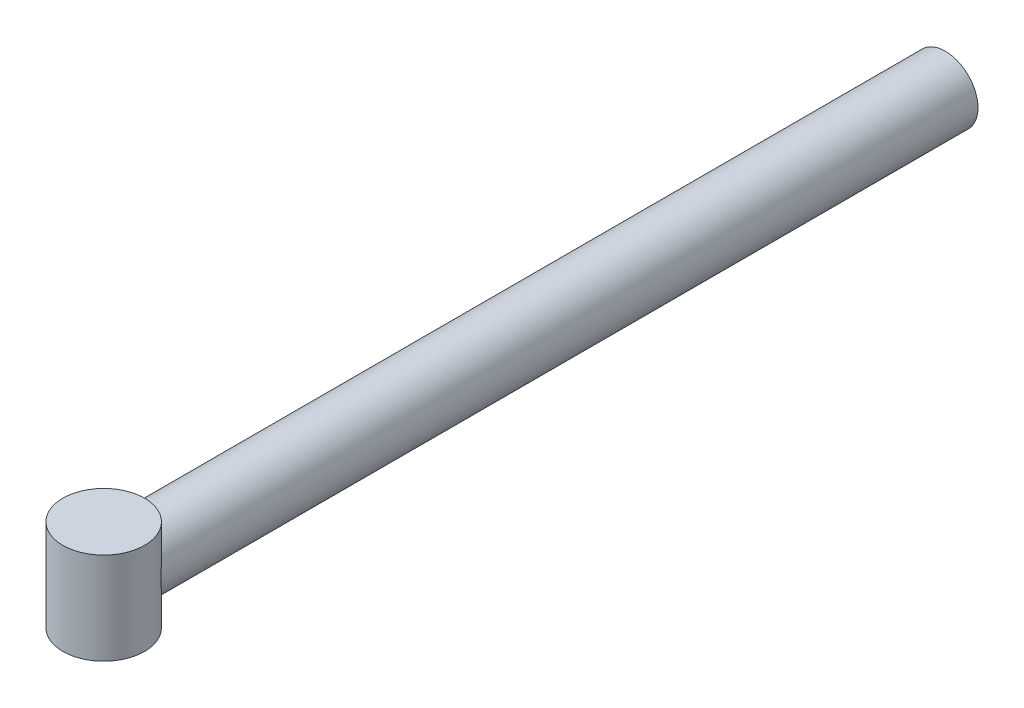
ISO-10303-21;
HEADER;
FILE_DESCRIPTION(('STEP AP214'),'2;1');
FILE_NAME('part.step','',(''),(''),'','','');
FILE_SCHEMA(('AUTOMOTIVE_DESIGN { 1 0 10303 214 1 1 1 1 }'));
ENDSEC;
DATA;
#1=APPLICATION_CONTEXT('core data for automotive mechanical design processes');
#2=APPLICATION_PROTOCOL_DEFINITION('international standard','automotive_design',2000,#1);
#3=PRODUCT_CONTEXT('',#1,'mechanical');
#4=PRODUCT('Part','Part','',(#3));
#5=PRODUCT_RELATED_PRODUCT_CATEGORY('part','',(#4));
#6=PRODUCT_DEFINITION_FORMATION('','',#4);
#7=PRODUCT_DEFINITION_CONTEXT('part definition',#1,'design');
#8=PRODUCT_DEFINITION('design','',#6,#7);
#9=PRODUCT_DEFINITION_SHAPE('','',#8);
#10=(LENGTH_UNIT() NAMED_UNIT(*) SI_UNIT(.MILLI.,.METRE.));
#11=(NAMED_UNIT(*) PLANE_ANGLE_UNIT() SI_UNIT($,.RADIAN.));
#12=(NAMED_UNIT(*) SI_UNIT($,.STERADIAN.) SOLID_ANGLE_UNIT());
#13=UNCERTAINTY_MEASURE_WITH_UNIT(LENGTH_MEASURE(1.E-05),#10,'distance_accuracy_value','');
#14=(GEOMETRIC_REPRESENTATION_CONTEXT(3) GLOBAL_UNCERTAINTY_ASSIGNED_CONTEXT((#13)) GLOBAL_UNIT_ASSIGNED_CONTEXT((#10,
#11,#12)) REPRESENTATION_CONTEXT('',''));
#15=CARTESIAN_POINT('',(0.,0.,0.));
#16=DIRECTION('',(0.,0.,1.));
#17=DIRECTION('',(1.,0.,0.));
#18=AXIS2_PLACEMENT_3D('',#15,#16,#17);
#19=CARTESIAN_POINT('',(0.,0.,196.));
#20=DIRECTION('',(0.,0.,-1.));
#21=DIRECTION('',(-1.,0.,0.));
#22=AXIS2_PLACEMENT_3D('',#19,#20,#21);
#23=CYLINDRICAL_SURFACE('',#22,8.);
#24=CARTESIAN_POINT('',(0.,0.,0.));
#25=DIRECTION('',(0.,0.,1.));
#26=DIRECTION('',(1.,0.,0.));
#27=AXIS2_PLACEMENT_3D('',#24,#25,#26);
#28=CIRCLE('',#27,8.);
#29=CARTESIAN_POINT('',(8.,0.,0.));
#30=VERTEX_POINT('',#29);
#31=EDGE_CURVE('E10',#30,#30,#28,.T.);
#32=ORIENTED_EDGE('',*,*,#31,.T.);
#33=EDGE_LOOP('',(#32));
#34=FACE_BOUND('',#33,.T.);
#35=CARTESIAN_POINT('',(-8.,0.,200.));
#36=CARTESIAN_POINT('',(-7.99999850547057,-0.150224597384872,199.999996437479));
#37=CARTESIAN_POINT('',(-7.99575712002106,-0.30050413160166,199.9943298853));
#38=CARTESIAN_POINT('',(-7.97889190649412,-0.599822762570288,199.971942989496));
#39=CARTESIAN_POINT('',(-7.96626236243051,-0.74886094324964,199.955215108327));
#40=CARTESIAN_POINT('',(-7.93287350748029,-1.04487223919572,199.911463888372));
#41=CARTESIAN_POINT('',(-7.9120936313708,-1.19183914867771,199.88441451072));
#42=CARTESIAN_POINT('',(-7.86281319571144,-1.4825420181236,199.821183730434));
#43=CARTESIAN_POINT('',(-7.83430749328154,-1.62627575657817,199.7849962459));
#44=CARTESIAN_POINT('',(-7.75884142962143,-1.95928819427814,199.690866152769));
#45=CARTESIAN_POINT('',(-7.70891139176625,-2.14699454247975,199.62973617357));
#46=CARTESIAN_POINT('',(-7.59693100706946,-2.51467773958043,199.496601236886));
#47=CARTESIAN_POINT('',(-7.53488026634113,-2.69465433705371,199.424595926003));
#48=CARTESIAN_POINT('',(-7.39933665411533,-3.04722385598971,199.272428278329));
#49=CARTESIAN_POINT('',(-7.32581587966415,-3.21979742729864,199.192246219351));
#50=CARTESIAN_POINT('',(-7.16807370451545,-3.55716094079826,199.026347294762));
#51=CARTESIAN_POINT('',(-7.08385257539726,-3.72195108039005,198.940630569649));
#52=CARTESIAN_POINT('',(-6.87278634555154,-4.10215769308784,198.73406817214));
#53=CARTESIAN_POINT('',(-6.74154128211599,-4.31433145410594,198.611728560567));
#54=CARTESIAN_POINT('',(-6.46055204176311,-4.72473552644333,198.364798740559));
#55=CARTESIAN_POINT('',(-6.31080122510044,-4.92296079286415,198.240207738109));
#56=CARTESIAN_POINT('',(-5.99323431368264,-5.30497690322164,197.99239839125));
#57=CARTESIAN_POINT('',(-5.82543282445919,-5.48877921215058,197.869179024771));
#58=CARTESIAN_POINT('',(-5.47186088496404,-5.84132029595654,197.627150024383));
#59=CARTESIAN_POINT('',(-5.2860964524364,-6.01006407939447,197.508338931992));
#60=CARTESIAN_POINT('',(-4.93523769395914,-6.29955870869471,197.300782280501));
#61=CARTESIAN_POINT('',(-4.773300959646,-6.42320823329404,197.210731223094));
#62=CARTESIAN_POINT('',(-4.43820831441267,-6.65914999828477,197.036857760384));
#63=CARTESIAN_POINT('',(-4.2650545845973,-6.77144443582189,196.95303415094));
#64=CARTESIAN_POINT('',(-3.90811229430166,-6.98353078174688,196.793217103482));
#65=CARTESIAN_POINT('',(-3.72433661319781,-7.0833373855595,196.717214480961));
#66=CARTESIAN_POINT('',(-3.34661343718592,-7.26942072543666,196.574454075727));
#67=CARTESIAN_POINT('',(-3.15266763681224,-7.35569970596085,196.507694759608));
#68=CARTESIAN_POINT('',(-2.78768994179332,-7.5007245521569,196.394837448765));
#69=CARTESIAN_POINT('',(-2.61802183428175,-7.56166661486986,196.34714401773));
#70=CARTESIAN_POINT('',(-2.27301580125697,-7.6724316798399,196.260131809181));
#71=CARTESIAN_POINT('',(-2.09767896323079,-7.72225680044521,196.220811436233));
#72=CARTESIAN_POINT('',(-1.74235286878641,-7.81010153789945,196.151296278787));
#73=CARTESIAN_POINT('',(-1.56236520089122,-7.84812512938336,196.12109842201));
#74=CARTESIAN_POINT('',(-1.19885362524063,-7.91181365838404,196.070426861491));
#75=CARTESIAN_POINT('',(-1.0153296752875,-7.93747844833067,196.049953273862));
#76=CARTESIAN_POINT('',(-0.645442904479308,-7.97609546968864,196.019120133535));
#77=CARTESIAN_POINT('',(-0.45907237895612,-7.98900275330996,196.008796341702));
#78=CARTESIAN_POINT('',(-0.0855968189260213,-8.00172379256273,195.99862164734));
#79=CARTESIAN_POINT('',(0.101508216993092,-8.00153752300758,195.998770764957));
#80=CARTESIAN_POINT('',(0.474947204374597,-7.98807470334787,196.009538482369));
#81=CARTESIAN_POINT('',(0.661281129513564,-7.97479771000683,196.020157436662));
#82=CARTESIAN_POINT('',(1.0317009677617,-7.93538178672806,196.051626094765));
#83=CARTESIAN_POINT('',(1.21578693261969,-7.90924315344384,196.072475562609));
#84=CARTESIAN_POINT('',(1.57035549635711,-7.84631181969092,196.122537409026));
#85=CARTESIAN_POINT('',(1.74103055156828,-7.81018184923011,196.151228579736));
#86=CARTESIAN_POINT('',(2.07822216463015,-7.72729892134606,196.216825294206));
#87=CARTESIAN_POINT('',(2.24473728927079,-7.68054235729816,196.253733626753));
#88=CARTESIAN_POINT('',(2.57267278104259,-7.5769987362147,196.335121115442));
#89=CARTESIAN_POINT('',(2.73409423889293,-7.52021384398611,196.379598637554));
#90=CARTESIAN_POINT('',(3.05123215137683,-7.39722556705918,196.475428168721));
#91=CARTESIAN_POINT('',(3.20694649201475,-7.33101873580909,196.52678269298));
#92=CARTESIAN_POINT('',(3.69392962994682,-7.10566605995238,196.700499974155));
#93=CARTESIAN_POINT('',(4.01344906782815,-6.92972868922836,196.834599444931));
#94=CARTESIAN_POINT('',(4.61890539752362,-6.54181378883855,197.124268199599));
#95=CARTESIAN_POINT('',(4.90482333755281,-6.32981608395801,197.279849493022));
#96=CARTESIAN_POINT('',(5.33520078810718,-5.96495562488034,197.540006894893));
#97=CARTESIAN_POINT('',(5.49079696244523,-5.82197680026018,197.640345745706));
#98=CARTESIAN_POINT('',(5.78920834677226,-5.52533478553694,197.844162126266));
#99=CARTESIAN_POINT('',(5.93202522428544,-5.37167299407892,197.947639244145));
#100=CARTESIAN_POINT('',(6.20495908338478,-5.05394986566675,198.156021177989));
#101=CARTESIAN_POINT('',(6.33505914332127,-4.88987513865481,198.260927690173));
#102=CARTESIAN_POINT('',(6.5822031705451,-4.55175259790762,198.470007691359));
#103=CARTESIAN_POINT('',(6.69924870134031,-4.37770598226785,198.57418126674));
#104=CARTESIAN_POINT('',(6.90938493162869,-4.03689456896995,198.76958112605));
#105=CARTESIAN_POINT('',(7.00369709967441,-3.87104374843251,198.861087845483));
#106=CARTESIAN_POINT('',(7.18111377588424,-3.53106003557809,199.039580949332));
#107=CARTESIAN_POINT('',(7.26421700200963,-3.35692619895513,199.12656681597));
#108=CARTESIAN_POINT('',(7.41852221314823,-3.00052371047962,199.293404863951));
#109=CARTESIAN_POINT('',(7.48974437690968,-2.81826953143255,199.373269031102));
#110=CARTESIAN_POINT('',(7.61961784585522,-2.44549083299329,199.523022591706));
#111=CARTESIAN_POINT('',(7.67827490034183,-2.2549701442279,199.592916542229));
#112=CARTESIAN_POINT('',(7.802468138106,-1.78888186265354,199.744236926416));
#113=CARTESIAN_POINT('',(7.86161401964439,-1.50937317616993,199.819362643878));
#114=CARTESIAN_POINT('',(7.92785703981829,-1.08163768728951,199.904890707339));
#115=CARTESIAN_POINT('',(7.94618750700997,-0.937742220797693,199.928866612479));
#116=CARTESIAN_POINT('',(7.97505562335784,-0.64782303658393,199.966835919483));
#117=CARTESIAN_POINT('',(7.98559344384275,-0.501799365724554,199.980829540816));
#118=CARTESIAN_POINT('',(7.99865927125614,-0.207894900109446,199.998202729218));
#119=CARTESIAN_POINT('',(8.00113968070391,-0.0600082318572548,200.001519222348));
#120=CARTESIAN_POINT('',(7.99789775429116,0.235510806429651,199.997197463397));
#121=CARTESIAN_POINT('',(7.99217554947408,0.383143180489197,199.989559386324));
#122=CARTESIAN_POINT('',(7.97265920777897,0.677069628848388,199.963696191809));
#123=CARTESIAN_POINT('',(7.95885728951073,0.8233622747526,199.945460868521));
#124=CARTESIAN_POINT('',(7.92347678294739,1.11350747652078,199.899233111825));
#125=CARTESIAN_POINT('',(7.90189335304496,1.2573584547189,199.871234604181));
#126=CARTESIAN_POINT('',(7.84493960984964,1.57788279667275,199.798422366849));
#127=CARTESIAN_POINT('',(7.80746054479984,1.75362146191373,199.751144510685));
#128=CARTESIAN_POINT('',(7.72176071100922,2.09907723166816,199.645550875675));
#129=CARTESIAN_POINT('',(7.6735345432082,2.26879125970797,199.587229551105));
#130=CARTESIAN_POINT('',(7.56699838694255,2.60215897488043,199.461857121497));
#131=CARTESIAN_POINT('',(7.50866488429104,2.76579742483155,199.394785751895));
#132=CARTESIAN_POINT('',(7.38261988831835,3.08652158747695,199.254197888836));
#133=CARTESIAN_POINT('',(7.31490797291799,3.24360700483515,199.180681105356));
#134=CARTESIAN_POINT('',(7.13750913219514,3.62179269911468,198.994344842242));
#135=CARTESIAN_POINT('',(7.02279764848337,3.83927496752558,198.87894097048));
#136=CARTESIAN_POINT('',(6.77531704020676,4.26085040578841,198.643074669565));
#137=CARTESIAN_POINT('',(6.64254050094868,4.46493802663262,198.522610177418));
#138=CARTESIAN_POINT('',(6.35927652866585,4.8599080288212,198.280260028642));
#139=CARTESIAN_POINT('',(6.20877175975432,5.05077718980287,198.158373087722));
#140=CARTESIAN_POINT('',(5.89040753321111,5.41869559737589,197.916493932003));
#141=CARTESIAN_POINT('',(5.72255079321846,5.59574700048332,197.796501423883));
#142=CARTESIAN_POINT('',(5.3670650550418,5.93770141714218,197.559567860182));
#143=CARTESIAN_POINT('',(5.17918701450815,6.10239378536135,197.442695248225));
#144=CARTESIAN_POINT('',(4.78588595979406,6.41548625129911,197.216678447658));
#145=CARTESIAN_POINT('',(4.58046020874131,6.56388379927631,197.107535469494));
#146=CARTESIAN_POINT('',(4.15319348553333,6.84220786278276,196.900152462667));
#147=CARTESIAN_POINT('',(3.93139916922694,6.97218401160413,196.801883299507));
#148=CARTESIAN_POINT('',(3.47195618236024,7.21197368756803,196.618818284401));
#149=CARTESIAN_POINT('',(3.23431659302676,7.32179863061082,196.53401480767));
#150=CARTESIAN_POINT('',(2.82388510571558,7.48716494596681,196.405424048214));
#151=CARTESIAN_POINT('',(2.65489537054561,7.54879037532833,196.357229063467));
#152=CARTESIAN_POINT('',(2.31120271030772,7.66100481932081,196.269132407207));
#153=CARTESIAN_POINT('',(2.13650128662403,7.71159670784888,196.229228576233));
#154=CARTESIAN_POINT('',(1.78241638140577,7.80104601765855,196.158477209921));
#155=CARTESIAN_POINT('',(1.60303543390239,7.83990965231649,196.127624879534));
#156=CARTESIAN_POINT('',(1.24064885437531,7.90535819768663,196.075570841282));
#157=CARTESIAN_POINT('',(1.05764309373694,7.93194267189601,196.054369476493));
#158=CARTESIAN_POINT('',(0.688660273637491,7.97247259551144,196.022015766308));
#159=CARTESIAN_POINT('',(0.502674742837951,7.98637105229934,196.010900784621));
#160=CARTESIAN_POINT('',(0.12985480240813,8.00112113298116,195.999104058441));
#161=CARTESIAN_POINT('',(-0.056979603849125,8.00197280867149,195.998422272526));
#162=CARTESIAN_POINT('',(-0.430005030742409,7.9906144106453,196.007507457306));
#163=CARTESIAN_POINT('',(-0.616196009410928,7.97840350047307,196.017275097123));
#164=CARTESIAN_POINT('',(-0.986452085103609,7.94112912725094,196.047040337626));
#165=CARTESIAN_POINT('',(-1.17051722858033,7.91606594558708,196.067037714344));
#166=CARTESIAN_POINT('',(-1.52534233748455,7.85518763356242,196.115484185211));
#167=CARTESIAN_POINT('',(-1.69628523757394,7.82002374677127,196.143420502703));
#168=CARTESIAN_POINT('',(-2.03409736547981,7.73903296117567,196.207552914752));
#169=CARTESIAN_POINT('',(-2.20096518428784,7.69320243035069,196.243751822661));
#170=CARTESIAN_POINT('',(-2.52967809365015,7.59146355168148,196.32377498985));
#171=CARTESIAN_POINT('',(-2.6915242269181,7.5355573126175,196.36759765346));
#172=CARTESIAN_POINT('',(-3.00956874161387,7.4142767663536,196.462177021965));
#173=CARTESIAN_POINT('',(-3.16576502616879,7.34889898806248,196.512936268562));
#174=CARTESIAN_POINT('',(-3.65335383729775,7.12656961704094,196.68450153543));
#175=CARTESIAN_POINT('',(-3.97317038012612,6.95285903456206,196.817074539721));
#176=CARTESIAN_POINT('',(-4.5795258547955,6.56939623029825,197.103893755561));
#177=CARTESIAN_POINT('',(-4.8660469821899,6.35962487260162,197.258151466294));
#178=CARTESIAN_POINT('',(-5.29741387615486,5.99851162441796,197.516299242384));
#179=CARTESIAN_POINT('',(-5.45332719334462,5.85705934680078,197.615856681024));
#180=CARTESIAN_POINT('',(-5.75249575586662,5.56351559635101,197.818228552881));
#181=CARTESIAN_POINT('',(-5.89575262538611,5.41142549315949,197.92104256588));
#182=CARTESIAN_POINT('',(-6.16969303597326,5.096905539555,198.128251460603));
#183=CARTESIAN_POINT('',(-6.30035965956408,4.93446225114858,198.232648257114));
#184=CARTESIAN_POINT('',(-6.54877096921904,4.59967861657431,198.440909165061));
#185=CARTESIAN_POINT('',(-6.66651708433834,4.4273393681539,198.544773334194));
#186=CARTESIAN_POINT('',(-6.87986147468855,4.08711386391033,198.741431208074));
#187=CARTESIAN_POINT('',(-6.97648055700592,3.91999282439702,198.834441344562));
#188=CARTESIAN_POINT('',(-7.15826985952809,3.57726205087538,199.016041678784));
#189=CARTESIAN_POINT('',(-7.24343854865576,3.40165118591891,199.104631284436));
#190=CARTESIAN_POINT('',(-7.40164833259944,3.04206127679532,199.274743536487));
#191=CARTESIAN_POINT('',(-7.47470603996769,2.85809414393556,199.356275788761));
#192=CARTESIAN_POINT('',(-7.60800017607481,2.48156626092665,199.509342870472));
#193=CARTESIAN_POINT('',(-7.66824305135968,2.2890098908808,199.580882720371));
#194=CARTESIAN_POINT('',(-7.75905938511667,1.95386340901158,199.691236616594));
#195=CARTESIAN_POINT('',(-7.79313760396692,1.81334518597964,199.733470835169));
#196=CARTESIAN_POINT('',(-7.85395376355246,1.52859014361041,199.809863008097));
#197=CARTESIAN_POINT('',(-7.88069427981941,1.38435464853029,199.844023795636));
#198=CARTESIAN_POINT('',(-7.92632124595051,1.09319663670031,199.902884343631));
#199=CARTESIAN_POINT('',(-7.94523144943217,0.946283679137896,199.927612699546));
#200=CARTESIAN_POINT('',(-7.97490856466575,0.650319581770234,199.96663899825));
#201=CARTESIAN_POINT('',(-7.98568117830565,0.501270013813221,199.980944244108));
#202=CARTESIAN_POINT('',(-7.99483909530783,0.293236604790742,199.993123948221));
#203=CARTESIAN_POINT('',(-7.99677323072384,0.234642539151645,199.995699642404));
#204=CARTESIAN_POINT('',(-7.99935405881775,0.117368450698284,199.999138475669));
#205=CARTESIAN_POINT('',(-8.00000058386955,0.0586884176874257,200.000001391774));
#206=CARTESIAN_POINT('',(-8.,0.,200.));
#207=B_SPLINE_CURVE_WITH_KNOTS('',3,(#35,#36,#37,#38,#39,#40,#41,#42,#43,#44,#45,#46,#47,#48,
#49,#50,#51,#52,#53,#54,#55,#56,#57,#58,#59,#60,#61,#62,#63,#64,#65,#66,#67,#68,#69,#70,#71,#72,
#73,#74,#75,#76,#77,#78,#79,#80,#81,#82,#83,#84,#85,#86,#87,#88,#89,#90,#91,#92,#93,#94,#95,#96,
#97,#98,#99,#100,#101,#102,#103,#104,#105,#106,#107,#108,#109,#110,#111,#112,#113,#114,#115,
#116,#117,#118,#119,#120,#121,#122,#123,#124,#125,#126,#127,#128,#129,#130,#131,#132,#133,#134,
#135,#136,#137,#138,#139,#140,#141,#142,#143,#144,#145,#146,#147,#148,#149,#150,#151,#152,#153,
#154,#155,#156,#157,#158,#159,#160,#161,#162,#163,#164,#165,#166,#167,#168,#169,#170,#171,#172,
#173,#174,#175,#176,#177,#178,#179,#180,#181,#182,#183,#184,#185,#186,#187,#188,#189,#190,#191,
#192,#193,#194,#195,#196,#197,#198,#199,#200,#201,#202,#203,#204,#205,#206),.UNSPECIFIED.,.T.,
.F.,(4,2,2,2,2,2,2,2,2,2,2,2,2,2,2,2,2,2,2,2,2,2,2,2,2,2,2,2,2,2,2,2,2,2,2,2,2,2,2,2,2,2,2,2,2,
2,2,2,2,2,2,2,2,2,2,2,2,2,2,2,2,2,2,2,2,2,2,2,2,2,2,2,2,2,2,2,2,2,2,2,2,2,2,2,2,4),(0.,
0.450606299614465,0.901519973676549,1.35357880611544,1.8059393045256,2.41584789433293,
3.0257763076505,3.63721230982388,4.24863279660231,5.08116194685193,5.91399067523191,
6.74615052600714,7.57803255543161,8.24571319317795,8.91326439024932,9.5800224870579,
10.2466698401778,10.8055557245148,11.3643350212721,11.9229259221237,12.4815234926587,
13.0420821963223,13.6026419782702,14.1632207407637,14.7237865741235,15.2536171560135,
15.7836278295953,16.3135242297492,16.8436149670074,18.0049267579594,19.1668904354684,
19.8681109783519,20.5692398876651,21.2712894046784,21.9732547485046,22.6075897572729,
23.2419972576007,23.875316063926,24.5083444664164,25.3907054643292,25.8313204999235,
26.2719258478914,26.7151292918451,27.1583256553425,27.6019495551256,28.045849952592,
28.6024005613437,29.1592313992438,29.7173755088329,30.2755447460868,31.0892572695395,
31.9033047896381,32.7181550553136,33.5328778931948,34.3592852448837,35.1858217254169,
36.0100870934492,36.8338840537071,37.3920107728034,37.9499919430164,38.5076769857722,
39.0653818517365,39.6251443288452,40.1849045836663,40.7447006845826,41.3044845299156,
41.8341418130277,42.363979710385,42.89370684462,43.4236286045014,44.5810964856002,
45.7391804922371,46.4372454590117,47.135220713401,47.8341211250874,48.5329441577693,
49.1753059573187,49.8177535643469,50.459312504776,51.1005479394881,51.5520690389131,
52.0034314512373,52.453414422329,52.9030818038455,53.0790977765726,53.255136662246),.UNSPECIFIED.);
#208=CARTESIAN_POINT('',(-8.,0.,200.));
#209=VERTEX_POINT('',#208);
#210=EDGE_CURVE('E47',#209,#209,#207,.T.);
#211=ORIENTED_EDGE('',*,*,#210,.F.);
#212=EDGE_LOOP('',(#211));
#213=FACE_BOUND('',#212,.T.);
#214=ADVANCED_FACE('F32',(#34,#213),#23,.T.);
#215=CARTESIAN_POINT('',(0.,0.,0.));
#216=DIRECTION('',(0.,0.,1.));
#217=DIRECTION('',(1.,0.,0.));
#218=AXIS2_PLACEMENT_3D('',#215,#216,#217);
#219=PLANE('',#218);
#220=ORIENTED_EDGE('',*,*,#31,.F.);
#221=EDGE_LOOP('',(#220));
#222=FACE_BOUND('',#221,.T.);
#223=CARTESIAN_POINT('',(0.,0.,0.));
#224=DIRECTION('',(0.,0.,1.));
#225=DIRECTION('',(1.,0.,0.));
#226=AXIS2_PLACEMENT_3D('',#223,#224,#225);
#227=CIRCLE('',#226,7.);
#228=CARTESIAN_POINT('',(7.,0.,0.));
#229=VERTEX_POINT('',#228);
#230=EDGE_CURVE('E39',#229,#229,#227,.T.);
#231=ORIENTED_EDGE('',*,*,#230,.T.);
#232=EDGE_LOOP('',(#231));
#233=FACE_BOUND('',#232,.T.);
#234=ADVANCED_FACE('F74',(#222,#233),#219,.F.);
#235=CARTESIAN_POINT('',(0.,0.,196.));
#236=DIRECTION('',(0.,0.,-1.));
#237=DIRECTION('',(-1.,0.,0.));
#238=AXIS2_PLACEMENT_3D('',#235,#236,#237);
#239=CYLINDRICAL_SURFACE('',#238,7.);
#240=CARTESIAN_POINT('',(0.,0.,196.));
#241=DIRECTION('',(0.,0.,1.));
#242=DIRECTION('',(1.,0.,0.));
#243=AXIS2_PLACEMENT_3D('',#240,#241,#242);
#244=CIRCLE('',#243,7.);
#245=CARTESIAN_POINT('',(7.,0.,196.));
#246=VERTEX_POINT('',#245);
#247=EDGE_CURVE('E43',#246,#246,#244,.T.);
#248=ORIENTED_EDGE('',*,*,#247,.T.);
#249=EDGE_LOOP('',(#248));
#250=FACE_BOUND('',#249,.T.);
#251=ORIENTED_EDGE('',*,*,#230,.F.);
#252=EDGE_LOOP('',(#251));
#253=FACE_BOUND('',#252,.T.);
#254=ADVANCED_FACE('F71',(#250,#253),#239,.F.);
#255=CARTESIAN_POINT('',(0.,0.,196.));
#256=DIRECTION('',(0.,0.,1.));
#257=DIRECTION('',(1.,0.,0.));
#258=AXIS2_PLACEMENT_3D('',#255,#256,#257);
#259=PLANE('',#258);
#260=ORIENTED_EDGE('',*,*,#247,.F.);
#261=EDGE_LOOP('',(#260));
#262=FACE_BOUND('',#261,.T.);
#263=ADVANCED_FACE('F65',(#262),#259,.F.);
#264=CARTESIAN_POINT('',(0.,11.25,206.));
#265=DIRECTION('',(0.,-1.,0.));
#266=DIRECTION('',(0.,0.,-1.));
#267=AXIS2_PLACEMENT_3D('',#264,#265,#266);
#268=CYLINDRICAL_SURFACE('',#267,10.);
#269=CARTESIAN_POINT('',(0.,-11.25,206.));
#270=DIRECTION('',(0.,1.,0.));
#271=DIRECTION('',(0.,0.,1.));
#272=AXIS2_PLACEMENT_3D('',#269,#270,#271);
#273=CIRCLE('',#272,10.);
#274=CARTESIAN_POINT('',(0.,-11.25,216.));
#275=VERTEX_POINT('',#274);
#276=EDGE_CURVE('E57',#275,#275,#273,.T.);
#277=ORIENTED_EDGE('',*,*,#276,.T.);
#278=EDGE_LOOP('',(#277));
#279=FACE_BOUND('',#278,.T.);
#280=CARTESIAN_POINT('',(0.,11.25,206.));
#281=DIRECTION('',(0.,1.,0.));
#282=DIRECTION('',(0.,0.,1.));
#283=AXIS2_PLACEMENT_3D('',#280,#281,#282);
#284=CIRCLE('',#283,10.);
#285=CARTESIAN_POINT('',(0.,11.25,216.));
#286=VERTEX_POINT('',#285);
#287=EDGE_CURVE('E56',#286,#286,#284,.T.);
#288=ORIENTED_EDGE('',*,*,#287,.F.);
#289=EDGE_LOOP('',(#288));
#290=FACE_BOUND('',#289,.T.);
#291=ORIENTED_EDGE('',*,*,#210,.T.);
#292=EDGE_LOOP('',(#291));
#293=FACE_BOUND('',#292,.T.);
#294=ADVANCED_FACE('F59',(#279,#290,#293),#268,.T.);
#295=CARTESIAN_POINT('',(0.,11.25,206.));
#296=DIRECTION('',(0.,1.,0.));
#297=DIRECTION('',(0.,0.,1.));
#298=AXIS2_PLACEMENT_3D('',#295,#296,#297);
#299=PLANE('',#298);
#300=ORIENTED_EDGE('',*,*,#287,.T.);
#301=EDGE_LOOP('',(#300));
#302=FACE_BOUND('',#301,.T.);
#303=ADVANCED_FACE('F64',(#302),#299,.T.);
#304=CARTESIAN_POINT('',(0.,-11.25,206.));
#305=DIRECTION('',(0.,1.,0.));
#306=DIRECTION('',(0.,0.,1.));
#307=AXIS2_PLACEMENT_3D('',#304,#305,#306);
#308=PLANE('',#307);
#309=ORIENTED_EDGE('',*,*,#276,.F.);
#310=EDGE_LOOP('',(#309));
#311=FACE_BOUND('',#310,.T.);
#312=ADVANCED_FACE('F67',(#311),#308,.F.);
#313=CLOSED_SHELL('',(#214,#234,#254,#263,#294,#303,#312));
#314=MANIFOLD_SOLID_BREP('B2',#313);
#315=ADVANCED_BREP_SHAPE_REPRESENTATION('',(#18,#314),#14);
#316=SHAPE_DEFINITION_REPRESENTATION(#9,#315);
ENDSEC;
END-ISO-10303-21;
